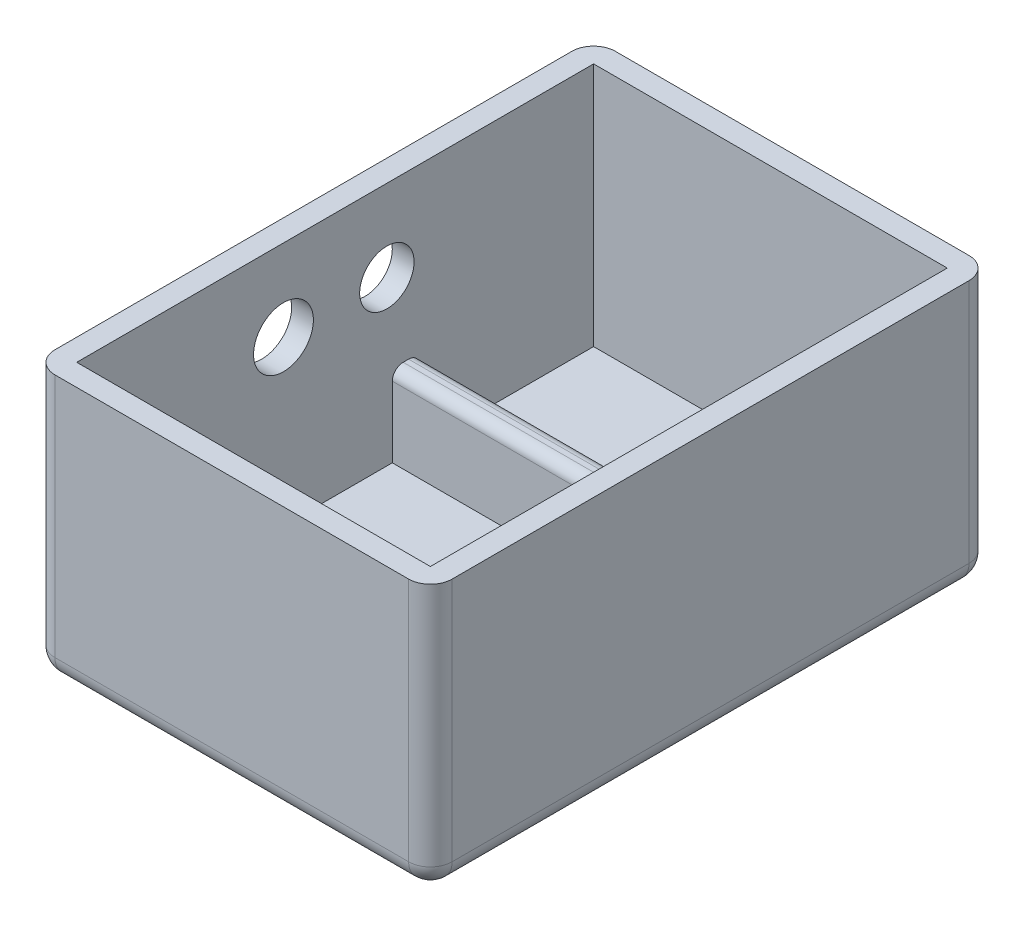
ISO-10303-21;
HEADER;
FILE_DESCRIPTION(('STEP AP214'),'2;1');
FILE_NAME('part.step','',(''),(''),'','','');
FILE_SCHEMA(('AUTOMOTIVE_DESIGN { 1 0 10303 214 1 1 1 1 }'));
ENDSEC;
DATA;
#1=APPLICATION_CONTEXT('core data for automotive mechanical design processes');
#2=APPLICATION_PROTOCOL_DEFINITION('international standard','automotive_design',2000,#1);
#3=PRODUCT_CONTEXT('',#1,'mechanical');
#4=PRODUCT('Part','Part','',(#3));
#5=PRODUCT_RELATED_PRODUCT_CATEGORY('part','',(#4));
#6=PRODUCT_DEFINITION_FORMATION('','',#4);
#7=PRODUCT_DEFINITION_CONTEXT('part definition',#1,'design');
#8=PRODUCT_DEFINITION('design','',#6,#7);
#9=PRODUCT_DEFINITION_SHAPE('','',#8);
#10=(LENGTH_UNIT() NAMED_UNIT(*) SI_UNIT(.MILLI.,.METRE.));
#11=(NAMED_UNIT(*) PLANE_ANGLE_UNIT() SI_UNIT($,.RADIAN.));
#12=(NAMED_UNIT(*) SI_UNIT($,.STERADIAN.) SOLID_ANGLE_UNIT());
#13=UNCERTAINTY_MEASURE_WITH_UNIT(LENGTH_MEASURE(1.E-05),#10,'distance_accuracy_value','');
#14=(GEOMETRIC_REPRESENTATION_CONTEXT(3) GLOBAL_UNCERTAINTY_ASSIGNED_CONTEXT((#13)) GLOBAL_UNIT_ASSIGNED_CONTEXT((#10,
#11,#12)) REPRESENTATION_CONTEXT('',''));
#15=CARTESIAN_POINT('',(0.,0.,0.));
#16=DIRECTION('',(0.,0.,1.));
#17=DIRECTION('',(1.,0.,0.));
#18=AXIS2_PLACEMENT_3D('',#15,#16,#17);
#19=CARTESIAN_POINT('',(32.5,45.,47.5));
#20=DIRECTION('',(-1.,0.,0.));
#21=DIRECTION('',(0.,0.,1.));
#22=AXIS2_PLACEMENT_3D('',#19,#20,#21);
#23=PLANE('',#22);
#24=DIRECTION('',(0.,0.,-1.));
#25=VECTOR('',#24,1.);
#26=CARTESIAN_POINT('',(32.5,15.,-15.5));
#27=LINE('',#26,#25);
#28=CARTESIAN_POINT('',(32.5,15.,-12.5));
#29=VERTEX_POINT('',#28);
#30=CARTESIAN_POINT('',(32.5,15.,-13.5));
#31=VERTEX_POINT('',#30);
#32=EDGE_CURVE('E190',#29,#31,#27,.T.);
#33=ORIENTED_EDGE('',*,*,#32,.F.);
#34=CARTESIAN_POINT('',(32.5,13.,-12.5));
#35=DIRECTION('',(-1.,0.,0.));
#36=DIRECTION('',(0.,0.,1.));
#37=AXIS2_PLACEMENT_3D('',#34,#35,#36);
#38=CIRCLE('',#37,2.);
#39=CARTESIAN_POINT('',(32.5,13.,-10.5));
#40=VERTEX_POINT('',#39);
#41=EDGE_CURVE('E409',#29,#40,#38,.F.);
#42=ORIENTED_EDGE('',*,*,#41,.T.);
#43=DIRECTION('',(0.,-1.,0.));
#44=VECTOR('',#43,1.);
#45=CARTESIAN_POINT('',(32.5,15.,-10.5));
#46=LINE('',#45,#44);
#47=CARTESIAN_POINT('',(32.5,0.,-10.5));
#48=VERTEX_POINT('',#47);
#49=EDGE_CURVE('E220',#40,#48,#46,.T.);
#50=ORIENTED_EDGE('',*,*,#49,.T.);
#51=DIRECTION('',(0.,0.,-1.));
#52=VECTOR('',#51,1.);
#53=CARTESIAN_POINT('',(32.5,0.,47.5));
#54=LINE('',#53,#52);
#55=CARTESIAN_POINT('',(32.5,0.,47.5));
#56=VERTEX_POINT('',#55);
#57=EDGE_CURVE('E241',#56,#48,#54,.T.);
#58=ORIENTED_EDGE('',*,*,#57,.F.);
#59=DIRECTION('',(0.,-1.,0.));
#60=VECTOR('',#59,1.);
#61=CARTESIAN_POINT('',(32.5,45.,47.5));
#62=LINE('',#61,#60);
#63=CARTESIAN_POINT('',(32.5,45.,47.5));
#64=VERTEX_POINT('',#63);
#65=EDGE_CURVE('E240',#64,#56,#62,.T.);
#66=ORIENTED_EDGE('',*,*,#65,.F.);
#67=DIRECTION('',(0.,0.,-1.));
#68=VECTOR('',#67,1.);
#69=CARTESIAN_POINT('',(32.5,45.,47.5));
#70=LINE('',#69,#68);
#71=CARTESIAN_POINT('',(32.5,45.,-47.5));
#72=VERTEX_POINT('',#71);
#73=EDGE_CURVE('E227',#64,#72,#70,.T.);
#74=ORIENTED_EDGE('',*,*,#73,.T.);
#75=DIRECTION('',(0.,-1.,0.));
#76=VECTOR('',#75,1.);
#77=CARTESIAN_POINT('',(32.5,45.,-47.5));
#78=LINE('',#77,#76);
#79=CARTESIAN_POINT('',(32.5,0.,-47.5));
#80=VERTEX_POINT('',#79);
#81=EDGE_CURVE('E259',#72,#80,#78,.T.);
#82=ORIENTED_EDGE('',*,*,#81,.T.);
#83=CARTESIAN_POINT('',(32.5,0.,-15.5));
#84=VERTEX_POINT('',#83);
#85=EDGE_CURVE('E226',#84,#80,#54,.T.);
#86=ORIENTED_EDGE('',*,*,#85,.F.);
#87=DIRECTION('',(0.,-1.,0.));
#88=VECTOR('',#87,1.);
#89=CARTESIAN_POINT('',(32.5,15.,-15.5));
#90=LINE('',#89,#88);
#91=CARTESIAN_POINT('',(32.5,13.,-15.5));
#92=VERTEX_POINT('',#91);
#93=EDGE_CURVE('E189',#92,#84,#90,.T.);
#94=ORIENTED_EDGE('',*,*,#93,.F.);
#95=CARTESIAN_POINT('',(32.5,13.,-13.5));
#96=DIRECTION('',(-1.,0.,0.));
#97=DIRECTION('',(0.,0.,1.));
#98=AXIS2_PLACEMENT_3D('',#95,#96,#97);
#99=CIRCLE('',#98,2.);
#100=EDGE_CURVE('E11',#92,#31,#99,.F.);
#101=ORIENTED_EDGE('',*,*,#100,.T.);
#102=EDGE_LOOP('',(#33,#42,#50,#58,#66,#74,#82,#86,#94,#101));
#103=FACE_BOUND('',#102,.T.);
#104=ADVANCED_FACE('F47',(#103),#23,.T.);
#105=CARTESIAN_POINT('',(-32.5,45.,47.5));
#106=DIRECTION('',(1.,0.,0.));
#107=DIRECTION('',(0.,0.,-1.));
#108=AXIS2_PLACEMENT_3D('',#105,#106,#107);
#109=PLANE('',#108);
#110=CARTESIAN_POINT('',(-32.5,30.,-9.49999999999999));
#111=DIRECTION('',(1.,0.,0.));
#112=DIRECTION('',(0.,0.,-1.));
#113=AXIS2_PLACEMENT_3D('',#110,#111,#112);
#114=CIRCLE('',#113,5.);
#115=CARTESIAN_POINT('',(-32.5,30.,-14.5));
#116=VERTEX_POINT('',#115);
#117=EDGE_CURVE('E284',#116,#116,#114,.T.);
#118=ORIENTED_EDGE('',*,*,#117,.F.);
#119=EDGE_LOOP('',(#118));
#120=FACE_BOUND('',#119,.T.);
#121=CARTESIAN_POINT('',(-32.5,30.,9.50000000000001));
#122=DIRECTION('',(1.,0.,0.));
#123=DIRECTION('',(0.,0.,-1.));
#124=AXIS2_PLACEMENT_3D('',#121,#122,#123);
#125=CIRCLE('',#124,5.5);
#126=CARTESIAN_POINT('',(-32.5,30.,4.00000000000001));
#127=VERTEX_POINT('',#126);
#128=EDGE_CURVE('E396',#127,#127,#125,.T.);
#129=ORIENTED_EDGE('',*,*,#128,.F.);
#130=EDGE_LOOP('',(#129));
#131=FACE_BOUND('',#130,.T.);
#132=DIRECTION('',(0.,0.,1.));
#133=VECTOR('',#132,1.);
#134=CARTESIAN_POINT('',(-32.5,0.,47.5));
#135=LINE('',#134,#133);
#136=CARTESIAN_POINT('',(-32.5,0.,-10.5));
#137=VERTEX_POINT('',#136);
#138=CARTESIAN_POINT('',(-32.5,0.,47.5));
#139=VERTEX_POINT('',#138);
#140=EDGE_CURVE('E202',#137,#139,#135,.T.);
#141=ORIENTED_EDGE('',*,*,#140,.F.);
#142=DIRECTION('',(0.,-1.,0.));
#143=VECTOR('',#142,1.);
#144=CARTESIAN_POINT('',(-32.5,15.,-10.5));
#145=LINE('',#144,#143);
#146=CARTESIAN_POINT('',(-32.5,13.,-10.5));
#147=VERTEX_POINT('',#146);
#148=EDGE_CURVE('E223',#147,#137,#145,.T.);
#149=ORIENTED_EDGE('',*,*,#148,.F.);
#150=CARTESIAN_POINT('',(-32.5,13.,-12.5));
#151=DIRECTION('',(1.,0.,0.));
#152=DIRECTION('',(0.,0.,-1.));
#153=AXIS2_PLACEMENT_3D('',#150,#151,#152);
#154=CIRCLE('',#153,2.);
#155=CARTESIAN_POINT('',(-32.5,15.,-12.5));
#156=VERTEX_POINT('',#155);
#157=EDGE_CURVE('E412',#147,#156,#154,.F.);
#158=ORIENTED_EDGE('',*,*,#157,.T.);
#159=DIRECTION('',(0.,0.,1.));
#160=VECTOR('',#159,1.);
#161=CARTESIAN_POINT('',(-32.5,15.,-15.5));
#162=LINE('',#161,#160);
#163=CARTESIAN_POINT('',(-32.5,15.,-13.5));
#164=VERTEX_POINT('',#163);
#165=EDGE_CURVE('E206',#164,#156,#162,.T.);
#166=ORIENTED_EDGE('',*,*,#165,.F.);
#167=CARTESIAN_POINT('',(-32.5,13.,-13.5));
#168=DIRECTION('',(1.,0.,0.));
#169=DIRECTION('',(0.,0.,-1.));
#170=AXIS2_PLACEMENT_3D('',#167,#168,#169);
#171=CIRCLE('',#170,2.);
#172=CARTESIAN_POINT('',(-32.5,13.,-15.5));
#173=VERTEX_POINT('',#172);
#174=EDGE_CURVE('E56',#164,#173,#171,.F.);
#175=ORIENTED_EDGE('',*,*,#174,.T.);
#176=DIRECTION('',(0.,-1.,0.));
#177=VECTOR('',#176,1.);
#178=CARTESIAN_POINT('',(-32.5,15.,-15.5));
#179=LINE('',#178,#177);
#180=CARTESIAN_POINT('',(-32.5,0.,-15.5));
#181=VERTEX_POINT('',#180);
#182=EDGE_CURVE('E181',#173,#181,#179,.T.);
#183=ORIENTED_EDGE('',*,*,#182,.T.);
#184=CARTESIAN_POINT('',(-32.5,0.,-47.5));
#185=VERTEX_POINT('',#184);
#186=EDGE_CURVE('E186',#185,#181,#135,.T.);
#187=ORIENTED_EDGE('',*,*,#186,.F.);
#188=DIRECTION('',(0.,-1.,0.));
#189=VECTOR('',#188,1.);
#190=CARTESIAN_POINT('',(-32.5,45.,-47.5));
#191=LINE('',#190,#189);
#192=CARTESIAN_POINT('',(-32.5,45.,-47.5));
#193=VERTEX_POINT('',#192);
#194=EDGE_CURVE('E256',#193,#185,#191,.T.);
#195=ORIENTED_EDGE('',*,*,#194,.F.);
#196=DIRECTION('',(0.,0.,1.));
#197=VECTOR('',#196,1.);
#198=CARTESIAN_POINT('',(-32.5,45.,47.5));
#199=LINE('',#198,#197);
#200=CARTESIAN_POINT('',(-32.5,45.,47.5));
#201=VERTEX_POINT('',#200);
#202=EDGE_CURVE('E233',#193,#201,#199,.T.);
#203=ORIENTED_EDGE('',*,*,#202,.T.);
#204=DIRECTION('',(0.,-1.,0.));
#205=VECTOR('',#204,1.);
#206=CARTESIAN_POINT('',(-32.5,45.,47.5));
#207=LINE('',#206,#205);
#208=EDGE_CURVE('E252',#201,#139,#207,.T.);
#209=ORIENTED_EDGE('',*,*,#208,.T.);
#210=EDGE_LOOP('',(#141,#149,#158,#166,#175,#183,#187,#195,#203,#209));
#211=FACE_BOUND('',#210,.T.);
#212=ADVANCED_FACE('F184',(#120,#131,#211),#109,.T.);
#213=CARTESIAN_POINT('',(0.,0.,0.));
#214=DIRECTION('',(0.,-1.,0.));
#215=DIRECTION('',(0.,0.,-1.));
#216=AXIS2_PLACEMENT_3D('',#213,#214,#215);
#217=PLANE('',#216);
#218=DIRECTION('',(1.,0.,0.));
#219=VECTOR('',#218,1.);
#220=CARTESIAN_POINT('',(-32.5,0.,-10.5));
#221=LINE('',#220,#219);
#222=EDGE_CURVE('E207',#137,#48,#221,.T.);
#223=ORIENTED_EDGE('',*,*,#222,.F.);
#224=ORIENTED_EDGE('',*,*,#140,.T.);
#225=DIRECTION('',(1.,0.,0.));
#226=VECTOR('',#225,1.);
#227=CARTESIAN_POINT('',(-32.5,0.,47.5));
#228=LINE('',#227,#226);
#229=EDGE_CURVE('E201',#139,#56,#228,.T.);
#230=ORIENTED_EDGE('',*,*,#229,.T.);
#231=ORIENTED_EDGE('',*,*,#57,.T.);
#232=EDGE_LOOP('',(#223,#224,#230,#231));
#233=FACE_BOUND('',#232,.T.);
#234=ADVANCED_FACE('F435',(#233),#217,.F.);
#235=DIRECTION('',(-1.,0.,0.));
#236=VECTOR('',#235,1.);
#237=CARTESIAN_POINT('',(-32.5,0.,-15.5));
#238=LINE('',#237,#236);
#239=EDGE_CURVE('E195',#84,#181,#238,.T.);
#240=ORIENTED_EDGE('',*,*,#239,.F.);
#241=ORIENTED_EDGE('',*,*,#85,.T.);
#242=DIRECTION('',(-1.,0.,0.));
#243=VECTOR('',#242,1.);
#244=CARTESIAN_POINT('',(-32.5,0.,-47.5));
#245=LINE('',#244,#243);
#246=EDGE_CURVE('E198',#80,#185,#245,.T.);
#247=ORIENTED_EDGE('',*,*,#246,.T.);
#248=ORIENTED_EDGE('',*,*,#186,.T.);
#249=EDGE_LOOP('',(#240,#241,#247,#248));
#250=FACE_BOUND('',#249,.T.);
#251=ADVANCED_FACE('F194',(#250),#217,.F.);
#252=CARTESIAN_POINT('',(0.,45.,0.));
#253=DIRECTION('',(0.,-1.,0.));
#254=DIRECTION('',(0.,0.,-1.));
#255=AXIS2_PLACEMENT_3D('',#252,#253,#254);
#256=PLANE('',#255);
#257=DIRECTION('',(0.,0.,-1.));
#258=VECTOR('',#257,1.);
#259=CARTESIAN_POINT('',(36.5,45.,0.));
#260=LINE('',#259,#258);
#261=CARTESIAN_POINT('',(36.5,45.,47.5));
#262=VERTEX_POINT('',#261);
#263=CARTESIAN_POINT('',(36.5,45.,-47.5));
#264=VERTEX_POINT('',#263);
#265=EDGE_CURVE('E263',#262,#264,#260,.T.);
#266=ORIENTED_EDGE('',*,*,#265,.T.);
#267=CARTESIAN_POINT('',(32.5,45.,-47.5));
#268=DIRECTION('',(0.,-1.,0.));
#269=DIRECTION('',(0.,0.,-1.));
#270=AXIS2_PLACEMENT_3D('',#267,#268,#269);
#271=CIRCLE('',#270,4.);
#272=CARTESIAN_POINT('',(32.5,45.,-51.5));
#273=VERTEX_POINT('',#272);
#274=EDGE_CURVE('E346',#264,#273,#271,.F.);
#275=ORIENTED_EDGE('',*,*,#274,.T.);
#276=DIRECTION('',(-1.,0.,0.));
#277=VECTOR('',#276,1.);
#278=CARTESIAN_POINT('',(0.,45.,-51.5));
#279=LINE('',#278,#277);
#280=CARTESIAN_POINT('',(-32.5,45.,-51.5));
#281=VERTEX_POINT('',#280);
#282=EDGE_CURVE('E267',#273,#281,#279,.T.);
#283=ORIENTED_EDGE('',*,*,#282,.T.);
#284=CARTESIAN_POINT('',(-32.5,45.,-47.5));
#285=DIRECTION('',(0.,-1.,0.));
#286=DIRECTION('',(0.,0.,-1.));
#287=AXIS2_PLACEMENT_3D('',#284,#285,#286);
#288=CIRCLE('',#287,4.);
#289=CARTESIAN_POINT('',(-36.5,45.,-47.5));
#290=VERTEX_POINT('',#289);
#291=EDGE_CURVE('E343',#281,#290,#288,.F.);
#292=ORIENTED_EDGE('',*,*,#291,.T.);
#293=DIRECTION('',(0.,0.,1.));
#294=VECTOR('',#293,1.);
#295=CARTESIAN_POINT('',(-36.5,45.,0.));
#296=LINE('',#295,#294);
#297=CARTESIAN_POINT('',(-36.5,45.,47.5));
#298=VERTEX_POINT('',#297);
#299=EDGE_CURVE('E271',#290,#298,#296,.T.);
#300=ORIENTED_EDGE('',*,*,#299,.T.);
#301=CARTESIAN_POINT('',(-32.5,45.,47.5));
#302=DIRECTION('',(0.,-1.,0.));
#303=DIRECTION('',(0.,0.,-1.));
#304=AXIS2_PLACEMENT_3D('',#301,#302,#303);
#305=CIRCLE('',#304,4.);
#306=CARTESIAN_POINT('',(-32.5,45.,51.5));
#307=VERTEX_POINT('',#306);
#308=EDGE_CURVE('E340',#298,#307,#305,.F.);
#309=ORIENTED_EDGE('',*,*,#308,.T.);
#310=DIRECTION('',(1.,0.,0.));
#311=VECTOR('',#310,1.);
#312=CARTESIAN_POINT('',(0.,45.,51.5));
#313=LINE('',#312,#311);
#314=CARTESIAN_POINT('',(32.5,45.,51.5));
#315=VERTEX_POINT('',#314);
#316=EDGE_CURVE('E275',#307,#315,#313,.T.);
#317=ORIENTED_EDGE('',*,*,#316,.T.);
#318=CARTESIAN_POINT('',(32.5,45.,47.5));
#319=DIRECTION('',(0.,-1.,0.));
#320=DIRECTION('',(0.,0.,-1.));
#321=AXIS2_PLACEMENT_3D('',#318,#319,#320);
#322=CIRCLE('',#321,4.);
#323=EDGE_CURVE('E337',#315,#262,#322,.F.);
#324=ORIENTED_EDGE('',*,*,#323,.T.);
#325=EDGE_LOOP('',(#266,#275,#283,#292,#300,#309,#317,#324));
#326=FACE_BOUND('',#325,.T.);
#327=ORIENTED_EDGE('',*,*,#73,.F.);
#328=DIRECTION('',(1.,0.,0.));
#329=VECTOR('',#328,1.);
#330=CARTESIAN_POINT('',(-32.5,45.,47.5));
#331=LINE('',#330,#329);
#332=EDGE_CURVE('E237',#201,#64,#331,.T.);
#333=ORIENTED_EDGE('',*,*,#332,.F.);
#334=ORIENTED_EDGE('',*,*,#202,.F.);
#335=DIRECTION('',(-1.,0.,0.));
#336=VECTOR('',#335,1.);
#337=CARTESIAN_POINT('',(-32.5,45.,-47.5));
#338=LINE('',#337,#336);
#339=EDGE_CURVE('E230',#72,#193,#338,.T.);
#340=ORIENTED_EDGE('',*,*,#339,.F.);
#341=EDGE_LOOP('',(#327,#333,#334,#340));
#342=FACE_BOUND('',#341,.T.);
#343=ADVANCED_FACE('F481',(#326,#342),#256,.F.);
#344=CARTESIAN_POINT('',(36.5,45.,47.5));
#345=DIRECTION('',(-1.,0.,0.));
#346=DIRECTION('',(0.,0.,1.));
#347=AXIS2_PLACEMENT_3D('',#344,#345,#346);
#348=PLANE('',#347);
#349=DIRECTION('',(0.,0.,-1.));
#350=VECTOR('',#349,1.);
#351=CARTESIAN_POINT('',(36.5,0.,-51.5));
#352=LINE('',#351,#350);
#353=CARTESIAN_POINT('',(36.5,0.,47.5));
#354=VERTEX_POINT('',#353);
#355=CARTESIAN_POINT('',(36.5,0.,-47.5));
#356=VERTEX_POINT('',#355);
#357=EDGE_CURVE('E322',#354,#356,#352,.T.);
#358=ORIENTED_EDGE('',*,*,#357,.T.);
#359=DIRECTION('',(0.,-1.,0.));
#360=VECTOR('',#359,1.);
#361=CARTESIAN_POINT('',(36.5,45.,-47.5));
#362=LINE('',#361,#360);
#363=EDGE_CURVE('E325',#356,#264,#362,.F.);
#364=ORIENTED_EDGE('',*,*,#363,.T.);
#365=ORIENTED_EDGE('',*,*,#265,.F.);
#366=DIRECTION('',(0.,-1.,0.));
#367=VECTOR('',#366,1.);
#368=CARTESIAN_POINT('',(36.5,45.,47.5));
#369=LINE('',#368,#367);
#370=EDGE_CURVE('E319',#262,#354,#369,.T.);
#371=ORIENTED_EDGE('',*,*,#370,.T.);
#372=EDGE_LOOP('',(#358,#364,#365,#371));
#373=FACE_BOUND('',#372,.T.);
#374=ADVANCED_FACE('F507',(#373),#348,.F.);
#375=CARTESIAN_POINT('',(-32.5,45.,-51.5));
#376=DIRECTION('',(0.,0.,1.));
#377=DIRECTION('',(1.,0.,0.));
#378=AXIS2_PLACEMENT_3D('',#375,#376,#377);
#379=PLANE('',#378);
#380=ORIENTED_EDGE('',*,*,#282,.F.);
#381=DIRECTION('',(0.,-1.,0.));
#382=VECTOR('',#381,1.);
#383=CARTESIAN_POINT('',(32.5,45.,-51.5));
#384=LINE('',#383,#382);
#385=CARTESIAN_POINT('',(32.5,0.,-51.5));
#386=VERTEX_POINT('',#385);
#387=EDGE_CURVE('E334',#273,#386,#384,.T.);
#388=ORIENTED_EDGE('',*,*,#387,.T.);
#389=DIRECTION('',(-1.,0.,0.));
#390=VECTOR('',#389,1.);
#391=CARTESIAN_POINT('',(-36.5,0.,-51.5));
#392=LINE('',#391,#390);
#393=CARTESIAN_POINT('',(-32.5,0.,-51.5));
#394=VERTEX_POINT('',#393);
#395=EDGE_CURVE('E331',#386,#394,#392,.T.);
#396=ORIENTED_EDGE('',*,*,#395,.T.);
#397=DIRECTION('',(0.,-1.,0.));
#398=VECTOR('',#397,1.);
#399=CARTESIAN_POINT('',(-32.5,45.,-51.5));
#400=LINE('',#399,#398);
#401=EDGE_CURVE('E328',#394,#281,#400,.F.);
#402=ORIENTED_EDGE('',*,*,#401,.T.);
#403=EDGE_LOOP('',(#380,#388,#396,#402));
#404=FACE_BOUND('',#403,.T.);
#405=ADVANCED_FACE('F450',(#404),#379,.F.);
#406=CARTESIAN_POINT('',(-36.5,45.,47.5));
#407=DIRECTION('',(1.,0.,0.));
#408=DIRECTION('',(0.,0.,-1.));
#409=AXIS2_PLACEMENT_3D('',#406,#407,#408);
#410=PLANE('',#409);
#411=CARTESIAN_POINT('',(-36.5,30.,-9.49999999999999));
#412=DIRECTION('',(1.,0.,0.));
#413=DIRECTION('',(0.,0.,-1.));
#414=AXIS2_PLACEMENT_3D('',#411,#412,#413);
#415=CIRCLE('',#414,5.);
#416=CARTESIAN_POINT('',(-36.5,30.,-14.5));
#417=VERTEX_POINT('',#416);
#418=EDGE_CURVE('E214',#417,#417,#415,.T.);
#419=ORIENTED_EDGE('',*,*,#418,.T.);
#420=EDGE_LOOP('',(#419));
#421=FACE_BOUND('',#420,.T.);
#422=CARTESIAN_POINT('',(-36.5,30.,9.50000000000001));
#423=DIRECTION('',(1.,0.,0.));
#424=DIRECTION('',(0.,0.,-1.));
#425=AXIS2_PLACEMENT_3D('',#422,#423,#424);
#426=CIRCLE('',#425,5.5);
#427=CARTESIAN_POINT('',(-36.5,30.,4.00000000000001));
#428=VERTEX_POINT('',#427);
#429=EDGE_CURVE('E280',#428,#428,#426,.T.);
#430=ORIENTED_EDGE('',*,*,#429,.T.);
#431=EDGE_LOOP('',(#430));
#432=FACE_BOUND('',#431,.T.);
#433=ORIENTED_EDGE('',*,*,#299,.F.);
#434=DIRECTION('',(0.,-1.,0.));
#435=VECTOR('',#434,1.);
#436=CARTESIAN_POINT('',(-36.5,45.,-47.5));
#437=LINE('',#436,#435);
#438=CARTESIAN_POINT('',(-36.5,0.,-47.5));
#439=VERTEX_POINT('',#438);
#440=EDGE_CURVE('E294',#290,#439,#437,.T.);
#441=ORIENTED_EDGE('',*,*,#440,.T.);
#442=DIRECTION('',(0.,0.,1.));
#443=VECTOR('',#442,1.);
#444=CARTESIAN_POINT('',(-36.5,0.,51.5));
#445=LINE('',#444,#443);
#446=CARTESIAN_POINT('',(-36.5,0.,47.5));
#447=VERTEX_POINT('',#446);
#448=EDGE_CURVE('E290',#439,#447,#445,.T.);
#449=ORIENTED_EDGE('',*,*,#448,.T.);
#450=DIRECTION('',(0.,-1.,0.));
#451=VECTOR('',#450,1.);
#452=CARTESIAN_POINT('',(-36.5,45.,47.5));
#453=LINE('',#452,#451);
#454=EDGE_CURVE('E279',#447,#298,#453,.F.);
#455=ORIENTED_EDGE('',*,*,#454,.T.);
#456=EDGE_LOOP('',(#433,#441,#449,#455));
#457=FACE_BOUND('',#456,.T.);
#458=ADVANCED_FACE('F446',(#421,#432,#457),#410,.F.);
#459=CARTESIAN_POINT('',(-32.5,45.,51.5));
#460=DIRECTION('',(0.,0.,-1.));
#461=DIRECTION('',(-1.,0.,0.));
#462=AXIS2_PLACEMENT_3D('',#459,#460,#461);
#463=PLANE('',#462);
#464=ORIENTED_EDGE('',*,*,#316,.F.);
#465=DIRECTION('',(0.,-1.,0.));
#466=VECTOR('',#465,1.);
#467=CARTESIAN_POINT('',(-32.5,45.,51.5));
#468=LINE('',#467,#466);
#469=CARTESIAN_POINT('',(-32.5,0.,51.5));
#470=VERTEX_POINT('',#469);
#471=EDGE_CURVE('E316',#307,#470,#468,.T.);
#472=ORIENTED_EDGE('',*,*,#471,.T.);
#473=DIRECTION('',(1.,0.,0.));
#474=VECTOR('',#473,1.);
#475=CARTESIAN_POINT('',(36.5,0.,51.5));
#476=LINE('',#475,#474);
#477=CARTESIAN_POINT('',(32.5,0.,51.5));
#478=VERTEX_POINT('',#477);
#479=EDGE_CURVE('E313',#470,#478,#476,.T.);
#480=ORIENTED_EDGE('',*,*,#479,.T.);
#481=DIRECTION('',(0.,-1.,0.));
#482=VECTOR('',#481,1.);
#483=CARTESIAN_POINT('',(32.5,45.,51.5));
#484=LINE('',#483,#482);
#485=EDGE_CURVE('E310',#478,#315,#484,.F.);
#486=ORIENTED_EDGE('',*,*,#485,.T.);
#487=EDGE_LOOP('',(#464,#472,#480,#486));
#488=FACE_BOUND('',#487,.T.);
#489=ADVANCED_FACE('F449',(#488),#463,.F.);
#490=CARTESIAN_POINT('',(0.,-4.,0.));
#491=DIRECTION('',(0.,-1.,0.));
#492=DIRECTION('',(0.,0.,-1.));
#493=AXIS2_PLACEMENT_3D('',#490,#491,#492);
#494=PLANE('',#493);
#495=DIRECTION('',(1.,0.,0.));
#496=VECTOR('',#495,1.);
#497=CARTESIAN_POINT('',(-36.5,-4.,47.5));
#498=LINE('',#497,#496);
#499=CARTESIAN_POINT('',(32.5,-4.,47.5));
#500=VERTEX_POINT('',#499);
#501=CARTESIAN_POINT('',(-32.5,-4.,47.5));
#502=VERTEX_POINT('',#501);
#503=EDGE_CURVE('E303',#500,#502,#498,.F.);
#504=ORIENTED_EDGE('',*,*,#503,.T.);
#505=DIRECTION('',(0.,0.,1.));
#506=VECTOR('',#505,1.);
#507=CARTESIAN_POINT('',(-32.5,-4.,-51.5));
#508=LINE('',#507,#506);
#509=CARTESIAN_POINT('',(-32.5,-4.,-47.5));
#510=VERTEX_POINT('',#509);
#511=EDGE_CURVE('E306',#502,#510,#508,.F.);
#512=ORIENTED_EDGE('',*,*,#511,.T.);
#513=DIRECTION('',(-1.,0.,0.));
#514=VECTOR('',#513,1.);
#515=CARTESIAN_POINT('',(36.5,-4.,-47.5));
#516=LINE('',#515,#514);
#517=CARTESIAN_POINT('',(32.5,-4.,-47.5));
#518=VERTEX_POINT('',#517);
#519=EDGE_CURVE('E297',#510,#518,#516,.F.);
#520=ORIENTED_EDGE('',*,*,#519,.T.);
#521=DIRECTION('',(0.,0.,-1.));
#522=VECTOR('',#521,1.);
#523=CARTESIAN_POINT('',(32.5,-4.,51.5));
#524=LINE('',#523,#522);
#525=EDGE_CURVE('E300',#518,#500,#524,.F.);
#526=ORIENTED_EDGE('',*,*,#525,.T.);
#527=EDGE_LOOP('',(#504,#512,#520,#526));
#528=FACE_BOUND('',#527,.T.);
#529=ADVANCED_FACE('F499',(#528),#494,.T.);
#530=CARTESIAN_POINT('',(-32.5,45.,-47.5));
#531=DIRECTION('',(0.,0.,1.));
#532=DIRECTION('',(1.,0.,0.));
#533=AXIS2_PLACEMENT_3D('',#530,#531,#532);
#534=PLANE('',#533);
#535=ORIENTED_EDGE('',*,*,#246,.F.);
#536=ORIENTED_EDGE('',*,*,#81,.F.);
#537=ORIENTED_EDGE('',*,*,#339,.T.);
#538=ORIENTED_EDGE('',*,*,#194,.T.);
#539=EDGE_LOOP('',(#535,#536,#537,#538));
#540=FACE_BOUND('',#539,.T.);
#541=ADVANCED_FACE('F538',(#540),#534,.T.);
#542=CARTESIAN_POINT('',(-32.5,45.,47.5));
#543=DIRECTION('',(0.,0.,-1.));
#544=DIRECTION('',(-1.,0.,0.));
#545=AXIS2_PLACEMENT_3D('',#542,#543,#544);
#546=PLANE('',#545);
#547=ORIENTED_EDGE('',*,*,#229,.F.);
#548=ORIENTED_EDGE('',*,*,#208,.F.);
#549=ORIENTED_EDGE('',*,*,#332,.T.);
#550=ORIENTED_EDGE('',*,*,#65,.T.);
#551=EDGE_LOOP('',(#547,#548,#549,#550));
#552=FACE_BOUND('',#551,.T.);
#553=ADVANCED_FACE('F627',(#552),#546,.T.);
#554=CARTESIAN_POINT('',(-32.5,15.,-10.5));
#555=DIRECTION('',(0.,0.,-1.));
#556=DIRECTION('',(-1.,0.,0.));
#557=AXIS2_PLACEMENT_3D('',#554,#555,#556);
#558=PLANE('',#557);
#559=ORIENTED_EDGE('',*,*,#49,.F.);
#560=DIRECTION('',(1.,0.,0.));
#561=VECTOR('',#560,1.);
#562=CARTESIAN_POINT('',(-32.5,13.,-10.5));
#563=LINE('',#562,#561);
#564=EDGE_CURVE('E404',#40,#147,#563,.F.);
#565=ORIENTED_EDGE('',*,*,#564,.T.);
#566=ORIENTED_EDGE('',*,*,#148,.T.);
#567=ORIENTED_EDGE('',*,*,#222,.T.);
#568=EDGE_LOOP('',(#559,#565,#566,#567));
#569=FACE_BOUND('',#568,.T.);
#570=ADVANCED_FACE('F633',(#569),#558,.F.);
#571=CARTESIAN_POINT('',(-32.5,15.,-15.5));
#572=DIRECTION('',(0.,0.,1.));
#573=DIRECTION('',(1.,0.,0.));
#574=AXIS2_PLACEMENT_3D('',#571,#572,#573);
#575=PLANE('',#574);
#576=ORIENTED_EDGE('',*,*,#182,.F.);
#577=DIRECTION('',(-1.,0.,0.));
#578=VECTOR('',#577,1.);
#579=CARTESIAN_POINT('',(32.5,13.,-15.5));
#580=LINE('',#579,#578);
#581=EDGE_CURVE('E63',#173,#92,#580,.F.);
#582=ORIENTED_EDGE('',*,*,#581,.T.);
#583=ORIENTED_EDGE('',*,*,#93,.T.);
#584=ORIENTED_EDGE('',*,*,#239,.T.);
#585=EDGE_LOOP('',(#576,#582,#583,#584));
#586=FACE_BOUND('',#585,.T.);
#587=ADVANCED_FACE('F204',(#586),#575,.F.);
#588=CARTESIAN_POINT('',(0.,15.,0.));
#589=DIRECTION('',(0.,1.,0.));
#590=DIRECTION('',(0.,0.,1.));
#591=AXIS2_PLACEMENT_3D('',#588,#589,#590);
#592=PLANE('',#591);
#593=ORIENTED_EDGE('',*,*,#165,.T.);
#594=DIRECTION('',(1.,0.,0.));
#595=VECTOR('',#594,1.);
#596=CARTESIAN_POINT('',(32.5,15.,-12.5));
#597=LINE('',#596,#595);
#598=EDGE_CURVE('E400',#156,#29,#597,.T.);
#599=ORIENTED_EDGE('',*,*,#598,.T.);
#600=ORIENTED_EDGE('',*,*,#32,.T.);
#601=DIRECTION('',(-1.,0.,0.));
#602=VECTOR('',#601,1.);
#603=CARTESIAN_POINT('',(-32.5,15.,-13.5));
#604=LINE('',#603,#602);
#605=EDGE_CURVE('E349',#31,#164,#604,.T.);
#606=ORIENTED_EDGE('',*,*,#605,.T.);
#607=EDGE_LOOP('',(#593,#599,#600,#606));
#608=FACE_BOUND('',#607,.T.);
#609=ADVANCED_FACE('F442',(#608),#592,.T.);
#610=CARTESIAN_POINT('',(-37.5,30.,9.50000000000001));
#611=DIRECTION('',(1.,0.,0.));
#612=DIRECTION('',(0.,0.,-1.));
#613=AXIS2_PLACEMENT_3D('',#610,#611,#612);
#614=CYLINDRICAL_SURFACE('',#613,5.5);
#615=ORIENTED_EDGE('',*,*,#128,.T.);
#616=EDGE_LOOP('',(#615));
#617=FACE_BOUND('',#616,.T.);
#618=ORIENTED_EDGE('',*,*,#429,.F.);
#619=EDGE_LOOP('',(#618));
#620=FACE_BOUND('',#619,.T.);
#621=ADVANCED_FACE('F439',(#617,#620),#614,.F.);
#622=CARTESIAN_POINT('',(-37.5,30.,-9.49999999999999));
#623=DIRECTION('',(1.,0.,0.));
#624=DIRECTION('',(0.,0.,-1.));
#625=AXIS2_PLACEMENT_3D('',#622,#623,#624);
#626=CYLINDRICAL_SURFACE('',#625,5.);
#627=ORIENTED_EDGE('',*,*,#117,.T.);
#628=EDGE_LOOP('',(#627));
#629=FACE_BOUND('',#628,.T.);
#630=ORIENTED_EDGE('',*,*,#418,.F.);
#631=EDGE_LOOP('',(#630));
#632=FACE_BOUND('',#631,.T.);
#633=ADVANCED_FACE('F430',(#629,#632),#626,.F.);
#634=CARTESIAN_POINT('',(32.5,45.,-47.5));
#635=DIRECTION('',(0.,-1.,0.));
#636=DIRECTION('',(0.,0.,-1.));
#637=AXIS2_PLACEMENT_3D('',#634,#635,#636);
#638=CYLINDRICAL_SURFACE('',#637,4.);
#639=ORIENTED_EDGE('',*,*,#274,.F.);
#640=ORIENTED_EDGE('',*,*,#363,.F.);
#641=CARTESIAN_POINT('',(32.5,0.,-47.5));
#642=DIRECTION('',(0.,-1.,0.));
#643=DIRECTION('',(0.,0.,-1.));
#644=AXIS2_PLACEMENT_3D('',#641,#642,#643);
#645=CIRCLE('',#644,4.);
#646=EDGE_CURVE('E388',#386,#356,#645,.T.);
#647=ORIENTED_EDGE('',*,*,#646,.F.);
#648=ORIENTED_EDGE('',*,*,#387,.F.);
#649=EDGE_LOOP('',(#639,#640,#647,#648));
#650=FACE_BOUND('',#649,.T.);
#651=ADVANCED_FACE('F512',(#650),#638,.T.);
#652=CARTESIAN_POINT('',(32.5,45.,47.5));
#653=DIRECTION('',(0.,-1.,0.));
#654=DIRECTION('',(0.,0.,-1.));
#655=AXIS2_PLACEMENT_3D('',#652,#653,#654);
#656=CYLINDRICAL_SURFACE('',#655,4.);
#657=ORIENTED_EDGE('',*,*,#323,.F.);
#658=ORIENTED_EDGE('',*,*,#485,.F.);
#659=CARTESIAN_POINT('',(32.5,0.,47.5));
#660=DIRECTION('',(0.,-1.,0.));
#661=DIRECTION('',(0.,0.,-1.));
#662=AXIS2_PLACEMENT_3D('',#659,#660,#661);
#663=CIRCLE('',#662,4.);
#664=EDGE_CURVE('E384',#354,#478,#663,.T.);
#665=ORIENTED_EDGE('',*,*,#664,.F.);
#666=ORIENTED_EDGE('',*,*,#370,.F.);
#667=EDGE_LOOP('',(#657,#658,#665,#666));
#668=FACE_BOUND('',#667,.T.);
#669=ADVANCED_FACE('F489',(#668),#656,.T.);
#670=CARTESIAN_POINT('',(32.5,0.,47.5));
#671=DIRECTION('',(0.,0.,1.));
#672=DIRECTION('',(1.,0.,0.));
#673=AXIS2_PLACEMENT_3D('',#670,#671,#672);
#674=CYLINDRICAL_SURFACE('',#673,4.);
#675=CARTESIAN_POINT('',(32.5,0.,-47.5));
#676=DIRECTION('',(0.,0.,-1.));
#677=DIRECTION('',(-1.,0.,0.));
#678=AXIS2_PLACEMENT_3D('',#675,#676,#677);
#679=CIRCLE('',#678,4.);
#680=EDGE_CURVE('E392',#356,#518,#679,.T.);
#681=ORIENTED_EDGE('',*,*,#680,.F.);
#682=ORIENTED_EDGE('',*,*,#357,.F.);
#683=CARTESIAN_POINT('',(32.5,0.,47.5));
#684=DIRECTION('',(0.,0.,1.));
#685=DIRECTION('',(1.,0.,0.));
#686=AXIS2_PLACEMENT_3D('',#683,#684,#685);
#687=CIRCLE('',#686,4.);
#688=EDGE_CURVE('E380',#500,#354,#687,.T.);
#689=ORIENTED_EDGE('',*,*,#688,.F.);
#690=ORIENTED_EDGE('',*,*,#525,.F.);
#691=EDGE_LOOP('',(#681,#682,#689,#690));
#692=FACE_BOUND('',#691,.T.);
#693=ADVANCED_FACE('F504',(#692),#674,.T.);
#694=CARTESIAN_POINT('',(32.5,0.,-47.5));
#695=DIRECTION('',(1.,0.,0.));
#696=DIRECTION('',(0.,0.,-1.));
#697=AXIS2_PLACEMENT_3D('',#694,#695,#696);
#698=SPHERICAL_SURFACE('',#697,4.);
#699=ORIENTED_EDGE('',*,*,#646,.T.);
#700=ORIENTED_EDGE('',*,*,#680,.T.);
#701=CARTESIAN_POINT('',(32.5,0.,-47.5));
#702=DIRECTION('',(1.,0.,0.));
#703=DIRECTION('',(0.,0.,-1.));
#704=AXIS2_PLACEMENT_3D('',#701,#702,#703);
#705=CIRCLE('',#704,4.);
#706=EDGE_CURVE('E376',#386,#518,#705,.F.);
#707=ORIENTED_EDGE('',*,*,#706,.F.);
#708=EDGE_LOOP('',(#699,#700,#707));
#709=FACE_BOUND('',#708,.T.);
#710=ADVANCED_FACE('F521',(#709),#698,.T.);
#711=CARTESIAN_POINT('',(32.5,0.,47.5));
#712=DIRECTION('',(1.,0.,0.));
#713=DIRECTION('',(0.,0.,-1.));
#714=AXIS2_PLACEMENT_3D('',#711,#712,#713);
#715=SPHERICAL_SURFACE('',#714,4.);
#716=ORIENTED_EDGE('',*,*,#688,.T.);
#717=ORIENTED_EDGE('',*,*,#664,.T.);
#718=CARTESIAN_POINT('',(32.5,0.,47.5));
#719=DIRECTION('',(1.,0.,0.));
#720=DIRECTION('',(0.,0.,-1.));
#721=AXIS2_PLACEMENT_3D('',#718,#719,#720);
#722=CIRCLE('',#721,4.);
#723=EDGE_CURVE('E372',#500,#478,#722,.F.);
#724=ORIENTED_EDGE('',*,*,#723,.F.);
#725=EDGE_LOOP('',(#716,#717,#724));
#726=FACE_BOUND('',#725,.T.);
#727=ADVANCED_FACE('F493',(#726),#715,.T.);
#728=CARTESIAN_POINT('',(-32.5,0.,-47.5));
#729=DIRECTION('',(1.,0.,0.));
#730=DIRECTION('',(0.,0.,-1.));
#731=AXIS2_PLACEMENT_3D('',#728,#729,#730);
#732=CYLINDRICAL_SURFACE('',#731,4.);
#733=ORIENTED_EDGE('',*,*,#706,.T.);
#734=ORIENTED_EDGE('',*,*,#519,.F.);
#735=CARTESIAN_POINT('',(-32.5,0.,-47.5));
#736=DIRECTION('',(-1.,0.,0.));
#737=DIRECTION('',(0.,0.,1.));
#738=AXIS2_PLACEMENT_3D('',#735,#736,#737);
#739=CIRCLE('',#738,4.);
#740=EDGE_CURVE('E368',#394,#510,#739,.T.);
#741=ORIENTED_EDGE('',*,*,#740,.F.);
#742=ORIENTED_EDGE('',*,*,#395,.F.);
#743=EDGE_LOOP('',(#733,#734,#741,#742));
#744=FACE_BOUND('',#743,.T.);
#745=ADVANCED_FACE('F519',(#744),#732,.T.);
#746=CARTESIAN_POINT('',(-32.5,45.,-47.5));
#747=DIRECTION('',(0.,-1.,0.));
#748=DIRECTION('',(0.,0.,-1.));
#749=AXIS2_PLACEMENT_3D('',#746,#747,#748);
#750=CYLINDRICAL_SURFACE('',#749,4.);
#751=ORIENTED_EDGE('',*,*,#291,.F.);
#752=ORIENTED_EDGE('',*,*,#401,.F.);
#753=CARTESIAN_POINT('',(-32.5,0.,-47.5));
#754=DIRECTION('',(0.,-1.,0.));
#755=DIRECTION('',(0.,0.,-1.));
#756=AXIS2_PLACEMENT_3D('',#753,#754,#755);
#757=CIRCLE('',#756,4.);
#758=EDGE_CURVE('E364',#439,#394,#757,.T.);
#759=ORIENTED_EDGE('',*,*,#758,.F.);
#760=ORIENTED_EDGE('',*,*,#440,.F.);
#761=EDGE_LOOP('',(#751,#752,#759,#760));
#762=FACE_BOUND('',#761,.T.);
#763=ADVANCED_FACE('F461',(#762),#750,.T.);
#764=CARTESIAN_POINT('',(-32.5,45.,47.5));
#765=DIRECTION('',(0.,-1.,0.));
#766=DIRECTION('',(0.,0.,-1.));
#767=AXIS2_PLACEMENT_3D('',#764,#765,#766);
#768=CYLINDRICAL_SURFACE('',#767,4.);
#769=ORIENTED_EDGE('',*,*,#308,.F.);
#770=ORIENTED_EDGE('',*,*,#454,.F.);
#771=CARTESIAN_POINT('',(-32.5,0.,47.5));
#772=DIRECTION('',(0.,-1.,0.));
#773=DIRECTION('',(0.,0.,-1.));
#774=AXIS2_PLACEMENT_3D('',#771,#772,#773);
#775=CIRCLE('',#774,4.);
#776=EDGE_CURVE('E360',#470,#447,#775,.T.);
#777=ORIENTED_EDGE('',*,*,#776,.F.);
#778=ORIENTED_EDGE('',*,*,#471,.F.);
#779=EDGE_LOOP('',(#769,#770,#777,#778));
#780=FACE_BOUND('',#779,.T.);
#781=ADVANCED_FACE('F479',(#780),#768,.T.);
#782=CARTESIAN_POINT('',(-32.5,0.,47.5));
#783=DIRECTION('',(-1.,0.,0.));
#784=DIRECTION('',(0.,0.,1.));
#785=AXIS2_PLACEMENT_3D('',#782,#783,#784);
#786=CYLINDRICAL_SURFACE('',#785,4.);
#787=ORIENTED_EDGE('',*,*,#723,.T.);
#788=ORIENTED_EDGE('',*,*,#479,.F.);
#789=CARTESIAN_POINT('',(-32.5,0.,47.5));
#790=DIRECTION('',(-1.,0.,0.));
#791=DIRECTION('',(0.,0.,1.));
#792=AXIS2_PLACEMENT_3D('',#789,#790,#791);
#793=CIRCLE('',#792,4.);
#794=EDGE_CURVE('E356',#502,#470,#793,.T.);
#795=ORIENTED_EDGE('',*,*,#794,.F.);
#796=ORIENTED_EDGE('',*,*,#503,.F.);
#797=EDGE_LOOP('',(#787,#788,#795,#796));
#798=FACE_BOUND('',#797,.T.);
#799=ADVANCED_FACE('F497',(#798),#786,.T.);
#800=CARTESIAN_POINT('',(-32.5,0.,-47.5));
#801=DIRECTION('',(0.,0.,-1.));
#802=DIRECTION('',(-1.,0.,0.));
#803=AXIS2_PLACEMENT_3D('',#800,#801,#802);
#804=SPHERICAL_SURFACE('',#803,4.);
#805=ORIENTED_EDGE('',*,*,#758,.T.);
#806=ORIENTED_EDGE('',*,*,#740,.T.);
#807=CARTESIAN_POINT('',(-32.5,0.,-47.5));
#808=DIRECTION('',(0.,0.,-1.));
#809=DIRECTION('',(-1.,0.,0.));
#810=AXIS2_PLACEMENT_3D('',#807,#808,#809);
#811=CIRCLE('',#810,4.);
#812=EDGE_CURVE('E353',#439,#510,#811,.F.);
#813=ORIENTED_EDGE('',*,*,#812,.F.);
#814=EDGE_LOOP('',(#805,#806,#813));
#815=FACE_BOUND('',#814,.T.);
#816=ADVANCED_FACE('F467',(#815),#804,.T.);
#817=CARTESIAN_POINT('',(-32.5,0.,47.5));
#818=DIRECTION('',(0.,0.,1.));
#819=DIRECTION('',(1.,0.,0.));
#820=AXIS2_PLACEMENT_3D('',#817,#818,#819);
#821=SPHERICAL_SURFACE('',#820,4.);
#822=ORIENTED_EDGE('',*,*,#794,.T.);
#823=ORIENTED_EDGE('',*,*,#776,.T.);
#824=CARTESIAN_POINT('',(-32.5,0.,47.5));
#825=DIRECTION('',(0.,0.,1.));
#826=DIRECTION('',(1.,0.,0.));
#827=AXIS2_PLACEMENT_3D('',#824,#825,#826);
#828=CIRCLE('',#827,4.);
#829=EDGE_CURVE('E350',#502,#447,#828,.F.);
#830=ORIENTED_EDGE('',*,*,#829,.F.);
#831=EDGE_LOOP('',(#822,#823,#830));
#832=FACE_BOUND('',#831,.T.);
#833=ADVANCED_FACE('F475',(#832),#821,.T.);
#834=CARTESIAN_POINT('',(-32.5,0.,47.5));
#835=DIRECTION('',(0.,0.,-1.));
#836=DIRECTION('',(-1.,0.,0.));
#837=AXIS2_PLACEMENT_3D('',#834,#835,#836);
#838=CYLINDRICAL_SURFACE('',#837,4.);
#839=ORIENTED_EDGE('',*,*,#812,.T.);
#840=ORIENTED_EDGE('',*,*,#511,.F.);
#841=ORIENTED_EDGE('',*,*,#829,.T.);
#842=ORIENTED_EDGE('',*,*,#448,.F.);
#843=EDGE_LOOP('',(#839,#840,#841,#842));
#844=FACE_BOUND('',#843,.T.);
#845=ADVANCED_FACE('F471',(#844),#838,.T.);
#846=CARTESIAN_POINT('',(0.,13.,-12.5));
#847=DIRECTION('',(-1.,0.,0.));
#848=DIRECTION('',(0.,0.,1.));
#849=AXIS2_PLACEMENT_3D('',#846,#847,#848);
#850=CYLINDRICAL_SURFACE('',#849,2.);
#851=ORIENTED_EDGE('',*,*,#157,.F.);
#852=ORIENTED_EDGE('',*,*,#564,.F.);
#853=ORIENTED_EDGE('',*,*,#41,.F.);
#854=ORIENTED_EDGE('',*,*,#598,.F.);
#855=EDGE_LOOP('',(#851,#852,#853,#854));
#856=FACE_BOUND('',#855,.T.);
#857=ADVANCED_FACE('F550',(#856),#850,.T.);
#858=CARTESIAN_POINT('',(0.,13.,-13.5));
#859=DIRECTION('',(1.,0.,0.));
#860=DIRECTION('',(0.,0.,-1.));
#861=AXIS2_PLACEMENT_3D('',#858,#859,#860);
#862=CYLINDRICAL_SURFACE('',#861,2.);
#863=ORIENTED_EDGE('',*,*,#100,.F.);
#864=ORIENTED_EDGE('',*,*,#581,.F.);
#865=ORIENTED_EDGE('',*,*,#174,.F.);
#866=ORIENTED_EDGE('',*,*,#605,.F.);
#867=EDGE_LOOP('',(#863,#864,#865,#866));
#868=FACE_BOUND('',#867,.T.);
#869=ADVANCED_FACE('F49',(#868),#862,.T.);
#870=CLOSED_SHELL('',(#104,#212,#234,#251,#343,#374,#405,#458,#489,#529,#541,#553,#570,#587,
#609,#621,#633,#651,#669,#693,#710,#727,#745,#763,#781,#799,#816,#833,#845,#857,#869));
#871=MANIFOLD_SOLID_BREP('B2',#870);
#872=ADVANCED_BREP_SHAPE_REPRESENTATION('',(#18,#871),#14);
#873=SHAPE_DEFINITION_REPRESENTATION(#9,#872);
ENDSEC;
END-ISO-10303-21;
